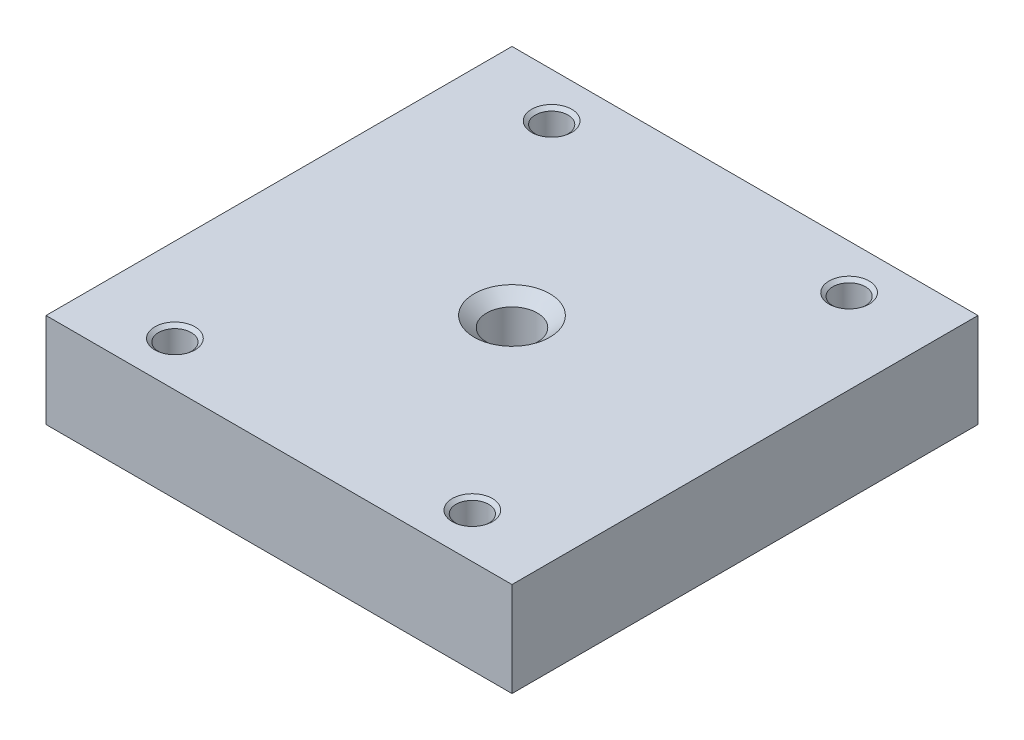
ISO-10303-21;
HEADER;
FILE_DESCRIPTION(('STEP AP214'),'2;1');
FILE_NAME('part.step','',(''),(''),'','','');
FILE_SCHEMA(('AUTOMOTIVE_DESIGN { 1 0 10303 214 1 1 1 1 }'));
ENDSEC;
DATA;
#1=APPLICATION_CONTEXT('core data for automotive mechanical design processes');
#2=APPLICATION_PROTOCOL_DEFINITION('international standard','automotive_design',2000,#1);
#3=PRODUCT_CONTEXT('',#1,'mechanical');
#4=PRODUCT('Part','Part','',(#3));
#5=PRODUCT_RELATED_PRODUCT_CATEGORY('part','',(#4));
#6=PRODUCT_DEFINITION_FORMATION('','',#4);
#7=PRODUCT_DEFINITION_CONTEXT('part definition',#1,'design');
#8=PRODUCT_DEFINITION('design','',#6,#7);
#9=PRODUCT_DEFINITION_SHAPE('','',#8);
#10=(LENGTH_UNIT() NAMED_UNIT(*) SI_UNIT(.MILLI.,.METRE.));
#11=(NAMED_UNIT(*) PLANE_ANGLE_UNIT() SI_UNIT($,.RADIAN.));
#12=(NAMED_UNIT(*) SI_UNIT($,.STERADIAN.) SOLID_ANGLE_UNIT());
#13=UNCERTAINTY_MEASURE_WITH_UNIT(LENGTH_MEASURE(1.E-05),#10,'distance_accuracy_value','');
#14=(GEOMETRIC_REPRESENTATION_CONTEXT(3) GLOBAL_UNCERTAINTY_ASSIGNED_CONTEXT((#13)) GLOBAL_UNIT_ASSIGNED_CONTEXT((#10,
#11,#12)) REPRESENTATION_CONTEXT('',''));
#15=CARTESIAN_POINT('',(0.,0.,0.));
#16=DIRECTION('',(0.,0.,1.));
#17=DIRECTION('',(1.,0.,0.));
#18=AXIS2_PLACEMENT_3D('',#15,#16,#17);
#19=CARTESIAN_POINT('',(0.,9.525,0.));
#20=DIRECTION('',(1.,0.,0.));
#21=DIRECTION('',(0.,0.,-1.));
#22=AXIS2_PLACEMENT_3D('',#19,#20,#21);
#23=PLANE('',#22);
#24=DIRECTION('',(0.,0.,1.));
#25=VECTOR('',#24,1.);
#26=CARTESIAN_POINT('',(0.,0.,0.));
#27=LINE('',#26,#25);
#28=CARTESIAN_POINT('',(0.,0.,-47.));
#29=VERTEX_POINT('',#28);
#30=CARTESIAN_POINT('',(0.,0.,0.));
#31=VERTEX_POINT('',#30);
#32=EDGE_CURVE('E113',#29,#31,#27,.T.);
#33=ORIENTED_EDGE('',*,*,#32,.T.);
#34=DIRECTION('',(0.,-1.,0.));
#35=VECTOR('',#34,1.);
#36=CARTESIAN_POINT('',(0.,9.525,0.));
#37=LINE('',#36,#35);
#38=CARTESIAN_POINT('',(0.,9.525,0.));
#39=VERTEX_POINT('',#38);
#40=EDGE_CURVE('E11',#39,#31,#37,.T.);
#41=ORIENTED_EDGE('',*,*,#40,.F.);
#42=DIRECTION('',(0.,0.,1.));
#43=VECTOR('',#42,1.);
#44=CARTESIAN_POINT('',(0.,9.525,0.));
#45=LINE('',#44,#43);
#46=CARTESIAN_POINT('',(0.,9.525,-47.));
#47=VERTEX_POINT('',#46);
#48=EDGE_CURVE('E97',#47,#39,#45,.T.);
#49=ORIENTED_EDGE('',*,*,#48,.F.);
#50=DIRECTION('',(0.,-1.,0.));
#51=VECTOR('',#50,1.);
#52=CARTESIAN_POINT('',(0.,9.525,-47.));
#53=LINE('',#52,#51);
#54=EDGE_CURVE('E109',#47,#29,#53,.T.);
#55=ORIENTED_EDGE('',*,*,#54,.T.);
#56=EDGE_LOOP('',(#33,#41,#49,#55));
#57=FACE_BOUND('',#56,.T.);
#58=ADVANCED_FACE('F45',(#57),#23,.F.);
#59=CARTESIAN_POINT('',(0.,9.525,0.));
#60=DIRECTION('',(0.,0.,-1.));
#61=DIRECTION('',(-1.,0.,0.));
#62=AXIS2_PLACEMENT_3D('',#59,#60,#61);
#63=PLANE('',#62);
#64=DIRECTION('',(1.,0.,0.));
#65=VECTOR('',#64,1.);
#66=CARTESIAN_POINT('',(0.,0.,0.));
#67=LINE('',#66,#65);
#68=CARTESIAN_POINT('',(47.,0.,0.));
#69=VERTEX_POINT('',#68);
#70=EDGE_CURVE('E102',#31,#69,#67,.T.);
#71=ORIENTED_EDGE('',*,*,#70,.T.);
#72=DIRECTION('',(0.,-1.,0.));
#73=VECTOR('',#72,1.);
#74=CARTESIAN_POINT('',(47.,9.525,0.));
#75=LINE('',#74,#73);
#76=CARTESIAN_POINT('',(47.,9.525,0.));
#77=VERTEX_POINT('',#76);
#78=EDGE_CURVE('E54',#77,#69,#75,.T.);
#79=ORIENTED_EDGE('',*,*,#78,.F.);
#80=DIRECTION('',(1.,0.,0.));
#81=VECTOR('',#80,1.);
#82=CARTESIAN_POINT('',(0.,9.525,0.));
#83=LINE('',#82,#81);
#84=EDGE_CURVE('E92',#39,#77,#83,.T.);
#85=ORIENTED_EDGE('',*,*,#84,.F.);
#86=ORIENTED_EDGE('',*,*,#40,.T.);
#87=EDGE_LOOP('',(#71,#79,#85,#86));
#88=FACE_BOUND('',#87,.T.);
#89=ADVANCED_FACE('F101',(#88),#63,.F.);
#90=CARTESIAN_POINT('',(47.,9.525,0.));
#91=DIRECTION('',(-1.,0.,0.));
#92=DIRECTION('',(0.,0.,1.));
#93=AXIS2_PLACEMENT_3D('',#90,#91,#92);
#94=PLANE('',#93);
#95=DIRECTION('',(0.,0.,-1.));
#96=VECTOR('',#95,1.);
#97=CARTESIAN_POINT('',(47.,0.,0.));
#98=LINE('',#97,#96);
#99=CARTESIAN_POINT('',(47.,0.,-47.));
#100=VERTEX_POINT('',#99);
#101=EDGE_CURVE('E79',#69,#100,#98,.T.);
#102=ORIENTED_EDGE('',*,*,#101,.T.);
#103=DIRECTION('',(0.,-1.,0.));
#104=VECTOR('',#103,1.);
#105=CARTESIAN_POINT('',(47.,9.525,-47.));
#106=LINE('',#105,#104);
#107=CARTESIAN_POINT('',(47.,9.525,-47.));
#108=VERTEX_POINT('',#107);
#109=EDGE_CURVE('E104',#108,#100,#106,.T.);
#110=ORIENTED_EDGE('',*,*,#109,.F.);
#111=DIRECTION('',(0.,0.,-1.));
#112=VECTOR('',#111,1.);
#113=CARTESIAN_POINT('',(47.,9.525,0.));
#114=LINE('',#113,#112);
#115=EDGE_CURVE('E95',#77,#108,#114,.T.);
#116=ORIENTED_EDGE('',*,*,#115,.F.);
#117=ORIENTED_EDGE('',*,*,#78,.T.);
#118=EDGE_LOOP('',(#102,#110,#116,#117));
#119=FACE_BOUND('',#118,.T.);
#120=ADVANCED_FACE('F105',(#119),#94,.F.);
#121=CARTESIAN_POINT('',(0.,9.525,-47.));
#122=DIRECTION('',(0.,0.,1.));
#123=DIRECTION('',(1.,0.,0.));
#124=AXIS2_PLACEMENT_3D('',#121,#122,#123);
#125=PLANE('',#124);
#126=DIRECTION('',(-1.,0.,0.));
#127=VECTOR('',#126,1.);
#128=CARTESIAN_POINT('',(0.,0.,-47.));
#129=LINE('',#128,#127);
#130=EDGE_CURVE('E85',#100,#29,#129,.T.);
#131=ORIENTED_EDGE('',*,*,#130,.T.);
#132=ORIENTED_EDGE('',*,*,#54,.F.);
#133=DIRECTION('',(-1.,0.,0.));
#134=VECTOR('',#133,1.);
#135=CARTESIAN_POINT('',(0.,9.525,-47.));
#136=LINE('',#135,#134);
#137=EDGE_CURVE('E62',#108,#47,#136,.T.);
#138=ORIENTED_EDGE('',*,*,#137,.F.);
#139=ORIENTED_EDGE('',*,*,#109,.T.);
#140=EDGE_LOOP('',(#131,#132,#138,#139));
#141=FACE_BOUND('',#140,.T.);
#142=ADVANCED_FACE('F127',(#141),#125,.F.);
#143=CARTESIAN_POINT('',(0.,9.525,0.));
#144=DIRECTION('',(0.,-1.,0.));
#145=DIRECTION('',(0.,0.,-1.));
#146=AXIS2_PLACEMENT_3D('',#143,#144,#145);
#147=PLANE('',#146);
#148=CARTESIAN_POINT('',(23.5,9.525,-23.5));
#149=DIRECTION('',(0.,1.,0.));
#150=DIRECTION('',(0.,0.,1.));
#151=AXIS2_PLACEMENT_3D('',#148,#149,#150);
#152=CIRCLE('',#151,3.81);
#153=CARTESIAN_POINT('',(23.5,9.525,-19.69));
#154=VERTEX_POINT('',#153);
#155=EDGE_CURVE('E189',#154,#154,#152,.T.);
#156=ORIENTED_EDGE('',*,*,#155,.F.);
#157=EDGE_LOOP('',(#156));
#158=FACE_BOUND('',#157,.T.);
#159=CARTESIAN_POINT('',(38.5,9.525,-42.5));
#160=DIRECTION('',(0.,1.,0.));
#161=DIRECTION('',(0.,0.,1.));
#162=AXIS2_PLACEMENT_3D('',#159,#160,#161);
#163=CIRCLE('',#162,2.025);
#164=CARTESIAN_POINT('',(38.5,9.525,-40.475));
#165=VERTEX_POINT('',#164);
#166=EDGE_CURVE('E177',#165,#165,#163,.T.);
#167=ORIENTED_EDGE('',*,*,#166,.F.);
#168=EDGE_LOOP('',(#167));
#169=FACE_BOUND('',#168,.T.);
#170=CARTESIAN_POINT('',(8.5,9.525,-42.5));
#171=DIRECTION('',(0.,1.,0.));
#172=DIRECTION('',(0.,0.,1.));
#173=AXIS2_PLACEMENT_3D('',#170,#171,#172);
#174=CIRCLE('',#173,2.025);
#175=CARTESIAN_POINT('',(8.5,9.525,-40.475));
#176=VERTEX_POINT('',#175);
#177=EDGE_CURVE('E165',#176,#176,#174,.T.);
#178=ORIENTED_EDGE('',*,*,#177,.F.);
#179=EDGE_LOOP('',(#178));
#180=FACE_BOUND('',#179,.T.);
#181=CARTESIAN_POINT('',(8.5,9.525,-4.5));
#182=DIRECTION('',(0.,1.,0.));
#183=DIRECTION('',(0.,0.,1.));
#184=AXIS2_PLACEMENT_3D('',#181,#182,#183);
#185=CIRCLE('',#184,2.025);
#186=CARTESIAN_POINT('',(8.5,9.525,-2.475));
#187=VERTEX_POINT('',#186);
#188=EDGE_CURVE('E153',#187,#187,#185,.T.);
#189=ORIENTED_EDGE('',*,*,#188,.F.);
#190=EDGE_LOOP('',(#189));
#191=FACE_BOUND('',#190,.T.);
#192=CARTESIAN_POINT('',(38.5,9.525,-4.5));
#193=DIRECTION('',(0.,1.,0.));
#194=DIRECTION('',(0.,0.,1.));
#195=AXIS2_PLACEMENT_3D('',#192,#193,#194);
#196=CIRCLE('',#195,2.025);
#197=CARTESIAN_POINT('',(38.5,9.525,-2.475));
#198=VERTEX_POINT('',#197);
#199=EDGE_CURVE('E141',#198,#198,#196,.T.);
#200=ORIENTED_EDGE('',*,*,#199,.F.);
#201=EDGE_LOOP('',(#200));
#202=FACE_BOUND('',#201,.T.);
#203=ORIENTED_EDGE('',*,*,#48,.T.);
#204=ORIENTED_EDGE('',*,*,#84,.T.);
#205=ORIENTED_EDGE('',*,*,#115,.T.);
#206=ORIENTED_EDGE('',*,*,#137,.T.);
#207=EDGE_LOOP('',(#203,#204,#205,#206));
#208=FACE_BOUND('',#207,.T.);
#209=ADVANCED_FACE('F93',(#158,#169,#180,#191,#202,#208),#147,.F.);
#210=CARTESIAN_POINT('',(0.,0.,0.));
#211=DIRECTION('',(0.,-1.,0.));
#212=DIRECTION('',(0.,0.,-1.));
#213=AXIS2_PLACEMENT_3D('',#210,#211,#212);
#214=PLANE('',#213);
#215=CARTESIAN_POINT('',(23.5,0.,-23.5));
#216=DIRECTION('',(0.,1.,0.));
#217=DIRECTION('',(0.,0.,1.));
#218=AXIS2_PLACEMENT_3D('',#215,#216,#217);
#219=CIRCLE('',#218,2.5527);
#220=CARTESIAN_POINT('',(23.5,0.,-20.9473));
#221=VERTEX_POINT('',#220);
#222=EDGE_CURVE('E181',#221,#221,#219,.T.);
#223=ORIENTED_EDGE('',*,*,#222,.T.);
#224=EDGE_LOOP('',(#223));
#225=FACE_BOUND('',#224,.T.);
#226=CARTESIAN_POINT('',(38.5,0.,-42.5));
#227=DIRECTION('',(0.,1.,0.));
#228=DIRECTION('',(0.,0.,1.));
#229=AXIS2_PLACEMENT_3D('',#226,#227,#228);
#230=CIRCLE('',#229,1.65);
#231=CARTESIAN_POINT('',(38.5,0.,-40.85));
#232=VERTEX_POINT('',#231);
#233=EDGE_CURVE('E169',#232,#232,#230,.T.);
#234=ORIENTED_EDGE('',*,*,#233,.T.);
#235=EDGE_LOOP('',(#234));
#236=FACE_BOUND('',#235,.T.);
#237=CARTESIAN_POINT('',(8.5,0.,-42.5));
#238=DIRECTION('',(0.,1.,0.));
#239=DIRECTION('',(0.,0.,1.));
#240=AXIS2_PLACEMENT_3D('',#237,#238,#239);
#241=CIRCLE('',#240,1.65);
#242=CARTESIAN_POINT('',(8.5,0.,-40.85));
#243=VERTEX_POINT('',#242);
#244=EDGE_CURVE('E157',#243,#243,#241,.T.);
#245=ORIENTED_EDGE('',*,*,#244,.T.);
#246=EDGE_LOOP('',(#245));
#247=FACE_BOUND('',#246,.T.);
#248=CARTESIAN_POINT('',(8.5,0.,-4.5));
#249=DIRECTION('',(0.,1.,0.));
#250=DIRECTION('',(0.,0.,1.));
#251=AXIS2_PLACEMENT_3D('',#248,#249,#250);
#252=CIRCLE('',#251,1.65);
#253=CARTESIAN_POINT('',(8.5,0.,-2.85));
#254=VERTEX_POINT('',#253);
#255=EDGE_CURVE('E145',#254,#254,#252,.T.);
#256=ORIENTED_EDGE('',*,*,#255,.T.);
#257=EDGE_LOOP('',(#256));
#258=FACE_BOUND('',#257,.T.);
#259=CARTESIAN_POINT('',(38.5,0.,-4.5));
#260=DIRECTION('',(0.,1.,0.));
#261=DIRECTION('',(0.,0.,1.));
#262=AXIS2_PLACEMENT_3D('',#259,#260,#261);
#263=CIRCLE('',#262,1.65);
#264=CARTESIAN_POINT('',(38.5,0.,-2.85));
#265=VERTEX_POINT('',#264);
#266=EDGE_CURVE('E117',#265,#265,#263,.T.);
#267=ORIENTED_EDGE('',*,*,#266,.T.);
#268=EDGE_LOOP('',(#267));
#269=FACE_BOUND('',#268,.T.);
#270=ORIENTED_EDGE('',*,*,#32,.F.);
#271=ORIENTED_EDGE('',*,*,#130,.F.);
#272=ORIENTED_EDGE('',*,*,#101,.F.);
#273=ORIENTED_EDGE('',*,*,#70,.F.);
#274=EDGE_LOOP('',(#270,#271,#272,#273));
#275=FACE_BOUND('',#274,.T.);
#276=ADVANCED_FACE('F130',(#225,#236,#247,#258,#269,#275),#214,.T.);
#277=CARTESIAN_POINT('',(38.5,9.525,-4.5));
#278=DIRECTION('',(0.,1.,0.));
#279=DIRECTION('',(0.,0.,1.));
#280=AXIS2_PLACEMENT_3D('',#277,#278,#279);
#281=CYLINDRICAL_SURFACE('',#280,1.65);
#282=ORIENTED_EDGE('',*,*,#266,.F.);
#283=EDGE_LOOP('',(#282));
#284=FACE_BOUND('',#283,.T.);
#285=CARTESIAN_POINT('',(38.5,9.21033763830852,-4.5));
#286=DIRECTION('',(0.,1.,0.));
#287=DIRECTION('',(0.,0.,1.));
#288=AXIS2_PLACEMENT_3D('',#285,#286,#287);
#289=CIRCLE('',#288,1.65);
#290=CARTESIAN_POINT('',(38.5,9.21033763830852,-2.85));
#291=VERTEX_POINT('',#290);
#292=EDGE_CURVE('E137',#291,#291,#289,.T.);
#293=ORIENTED_EDGE('',*,*,#292,.T.);
#294=EDGE_LOOP('',(#293));
#295=FACE_BOUND('',#294,.T.);
#296=ADVANCED_FACE('F210',(#284,#295),#281,.F.);
#297=CARTESIAN_POINT('',(38.5,9.525,-4.5));
#298=DIRECTION('',(0.,1.,0.));
#299=DIRECTION('',(0.,0.,1.));
#300=AXIS2_PLACEMENT_3D('',#297,#298,#299);
#301=CONICAL_SURFACE('',#300,2.025,0.872664625997167);
#302=ORIENTED_EDGE('',*,*,#292,.F.);
#303=EDGE_LOOP('',(#302));
#304=FACE_BOUND('',#303,.T.);
#305=ORIENTED_EDGE('',*,*,#199,.T.);
#306=EDGE_LOOP('',(#305));
#307=FACE_BOUND('',#306,.T.);
#308=ADVANCED_FACE('F207',(#304,#307),#301,.F.);
#309=CARTESIAN_POINT('',(8.5,9.525,-4.5));
#310=DIRECTION('',(0.,1.,0.));
#311=DIRECTION('',(0.,0.,1.));
#312=AXIS2_PLACEMENT_3D('',#309,#310,#311);
#313=CYLINDRICAL_SURFACE('',#312,1.65);
#314=ORIENTED_EDGE('',*,*,#255,.F.);
#315=EDGE_LOOP('',(#314));
#316=FACE_BOUND('',#315,.T.);
#317=CARTESIAN_POINT('',(8.5,9.21033763830852,-4.5));
#318=DIRECTION('',(0.,1.,0.));
#319=DIRECTION('',(0.,0.,1.));
#320=AXIS2_PLACEMENT_3D('',#317,#318,#319);
#321=CIRCLE('',#320,1.65);
#322=CARTESIAN_POINT('',(8.5,9.21033763830852,-2.85));
#323=VERTEX_POINT('',#322);
#324=EDGE_CURVE('E149',#323,#323,#321,.T.);
#325=ORIENTED_EDGE('',*,*,#324,.T.);
#326=EDGE_LOOP('',(#325));
#327=FACE_BOUND('',#326,.T.);
#328=ADVANCED_FACE('F209',(#316,#327),#313,.F.);
#329=CARTESIAN_POINT('',(8.5,9.525,-4.5));
#330=DIRECTION('',(0.,1.,0.));
#331=DIRECTION('',(0.,0.,1.));
#332=AXIS2_PLACEMENT_3D('',#329,#330,#331);
#333=CONICAL_SURFACE('',#332,2.025,0.872664625997167);
#334=ORIENTED_EDGE('',*,*,#324,.F.);
#335=EDGE_LOOP('',(#334));
#336=FACE_BOUND('',#335,.T.);
#337=ORIENTED_EDGE('',*,*,#188,.T.);
#338=EDGE_LOOP('',(#337));
#339=FACE_BOUND('',#338,.T.);
#340=ADVANCED_FACE('F217',(#336,#339),#333,.F.);
#341=CARTESIAN_POINT('',(8.5,9.525,-42.5));
#342=DIRECTION('',(0.,1.,0.));
#343=DIRECTION('',(0.,0.,1.));
#344=AXIS2_PLACEMENT_3D('',#341,#342,#343);
#345=CYLINDRICAL_SURFACE('',#344,1.65);
#346=ORIENTED_EDGE('',*,*,#244,.F.);
#347=EDGE_LOOP('',(#346));
#348=FACE_BOUND('',#347,.T.);
#349=CARTESIAN_POINT('',(8.5,9.21033763830852,-42.5));
#350=DIRECTION('',(0.,1.,0.));
#351=DIRECTION('',(0.,0.,1.));
#352=AXIS2_PLACEMENT_3D('',#349,#350,#351);
#353=CIRCLE('',#352,1.65);
#354=CARTESIAN_POINT('',(8.5,9.21033763830852,-40.85));
#355=VERTEX_POINT('',#354);
#356=EDGE_CURVE('E161',#355,#355,#353,.T.);
#357=ORIENTED_EDGE('',*,*,#356,.T.);
#358=EDGE_LOOP('',(#357));
#359=FACE_BOUND('',#358,.T.);
#360=ADVANCED_FACE('F253',(#348,#359),#345,.F.);
#361=CARTESIAN_POINT('',(8.5,9.525,-42.5));
#362=DIRECTION('',(0.,1.,0.));
#363=DIRECTION('',(0.,0.,1.));
#364=AXIS2_PLACEMENT_3D('',#361,#362,#363);
#365=CONICAL_SURFACE('',#364,2.025,0.872664625997167);
#366=ORIENTED_EDGE('',*,*,#356,.F.);
#367=EDGE_LOOP('',(#366));
#368=FACE_BOUND('',#367,.T.);
#369=ORIENTED_EDGE('',*,*,#177,.T.);
#370=EDGE_LOOP('',(#369));
#371=FACE_BOUND('',#370,.T.);
#372=ADVANCED_FACE('F258',(#368,#371),#365,.F.);
#373=CARTESIAN_POINT('',(38.5,9.525,-42.5));
#374=DIRECTION('',(0.,1.,0.));
#375=DIRECTION('',(0.,0.,1.));
#376=AXIS2_PLACEMENT_3D('',#373,#374,#375);
#377=CYLINDRICAL_SURFACE('',#376,1.65);
#378=ORIENTED_EDGE('',*,*,#233,.F.);
#379=EDGE_LOOP('',(#378));
#380=FACE_BOUND('',#379,.T.);
#381=CARTESIAN_POINT('',(38.5,9.21033763830852,-42.5));
#382=DIRECTION('',(0.,1.,0.));
#383=DIRECTION('',(0.,0.,1.));
#384=AXIS2_PLACEMENT_3D('',#381,#382,#383);
#385=CIRCLE('',#384,1.65);
#386=CARTESIAN_POINT('',(38.5,9.21033763830852,-40.85));
#387=VERTEX_POINT('',#386);
#388=EDGE_CURVE('E173',#387,#387,#385,.T.);
#389=ORIENTED_EDGE('',*,*,#388,.T.);
#390=EDGE_LOOP('',(#389));
#391=FACE_BOUND('',#390,.T.);
#392=ADVANCED_FACE('F264',(#380,#391),#377,.F.);
#393=CARTESIAN_POINT('',(38.5,9.525,-42.5));
#394=DIRECTION('',(0.,1.,0.));
#395=DIRECTION('',(0.,0.,1.));
#396=AXIS2_PLACEMENT_3D('',#393,#394,#395);
#397=CONICAL_SURFACE('',#396,2.025,0.872664625997167);
#398=ORIENTED_EDGE('',*,*,#388,.F.);
#399=EDGE_LOOP('',(#398));
#400=FACE_BOUND('',#399,.T.);
#401=ORIENTED_EDGE('',*,*,#166,.T.);
#402=EDGE_LOOP('',(#401));
#403=FACE_BOUND('',#402,.T.);
#404=ADVANCED_FACE('F268',(#400,#403),#397,.F.);
#405=CARTESIAN_POINT('',(23.5,9.525,-23.5));
#406=DIRECTION('',(0.,1.,0.));
#407=DIRECTION('',(0.,0.,1.));
#408=AXIS2_PLACEMENT_3D('',#405,#406,#407);
#409=CYLINDRICAL_SURFACE('',#408,2.5527);
#410=ORIENTED_EDGE('',*,*,#222,.F.);
#411=EDGE_LOOP('',(#410));
#412=FACE_BOUND('',#411,.T.);
#413=CARTESIAN_POINT('',(23.5,8.4700000337208,-23.5));
#414=DIRECTION('',(0.,1.,0.));
#415=DIRECTION('',(0.,0.,1.));
#416=AXIS2_PLACEMENT_3D('',#413,#414,#415);
#417=CIRCLE('',#416,2.5527);
#418=CARTESIAN_POINT('',(23.5,8.4700000337208,-20.9473));
#419=VERTEX_POINT('',#418);
#420=EDGE_CURVE('E185',#419,#419,#417,.T.);
#421=ORIENTED_EDGE('',*,*,#420,.T.);
#422=EDGE_LOOP('',(#421));
#423=FACE_BOUND('',#422,.T.);
#424=ADVANCED_FACE('F272',(#412,#423),#409,.F.);
#425=CARTESIAN_POINT('',(23.5,9.525,-23.5));
#426=DIRECTION('',(0.,1.,0.));
#427=DIRECTION('',(0.,0.,1.));
#428=AXIS2_PLACEMENT_3D('',#425,#426,#427);
#429=CONICAL_SURFACE('',#428,3.81,0.872664625997165);
#430=ORIENTED_EDGE('',*,*,#420,.F.);
#431=EDGE_LOOP('',(#430));
#432=FACE_BOUND('',#431,.T.);
#433=ORIENTED_EDGE('',*,*,#155,.T.);
#434=EDGE_LOOP('',(#433));
#435=FACE_BOUND('',#434,.T.);
#436=ADVANCED_FACE('F194',(#432,#435),#429,.F.);
#437=CLOSED_SHELL('',(#58,#89,#120,#142,#209,#276,#296,#308,#328,#340,#360,#372,#392,#404,#424,#436));
#438=MANIFOLD_SOLID_BREP('B2',#437);
#439=ADVANCED_BREP_SHAPE_REPRESENTATION('',(#18,#438),#14);
#440=SHAPE_DEFINITION_REPRESENTATION(#9,#439);
ENDSEC;
END-ISO-10303-21;
